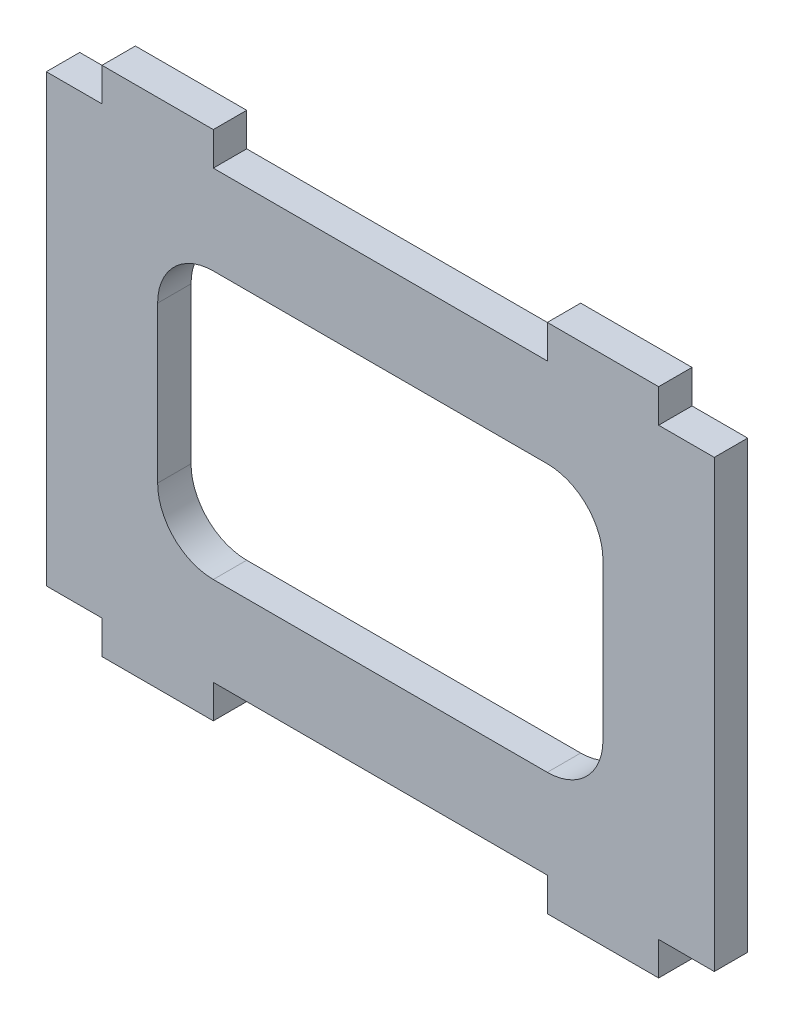
ISO-10303-21;
HEADER;
FILE_DESCRIPTION(('STEP AP214'),'2;1');
FILE_NAME('part.step','',(''),(''),'','','');
FILE_SCHEMA(('AUTOMOTIVE_DESIGN { 1 0 10303 214 1 1 1 1 }'));
ENDSEC;
DATA;
#1=APPLICATION_CONTEXT('core data for automotive mechanical design processes');
#2=APPLICATION_PROTOCOL_DEFINITION('international standard','automotive_design',2000,#1);
#3=PRODUCT_CONTEXT('',#1,'mechanical');
#4=PRODUCT('Part','Part','',(#3));
#5=PRODUCT_RELATED_PRODUCT_CATEGORY('part','',(#4));
#6=PRODUCT_DEFINITION_FORMATION('','',#4);
#7=PRODUCT_DEFINITION_CONTEXT('part definition',#1,'design');
#8=PRODUCT_DEFINITION('design','',#6,#7);
#9=PRODUCT_DEFINITION_SHAPE('','',#8);
#10=(LENGTH_UNIT() NAMED_UNIT(*) SI_UNIT(.MILLI.,.METRE.));
#11=(NAMED_UNIT(*) PLANE_ANGLE_UNIT() SI_UNIT($,.RADIAN.));
#12=(NAMED_UNIT(*) SI_UNIT($,.STERADIAN.) SOLID_ANGLE_UNIT());
#13=UNCERTAINTY_MEASURE_WITH_UNIT(LENGTH_MEASURE(1.E-05),#10,'distance_accuracy_value','');
#14=(GEOMETRIC_REPRESENTATION_CONTEXT(3) GLOBAL_UNCERTAINTY_ASSIGNED_CONTEXT((#13)) GLOBAL_UNIT_ASSIGNED_CONTEXT((#10,
#11,#12)) REPRESENTATION_CONTEXT('',''));
#15=CARTESIAN_POINT('',(0.,0.,0.));
#16=DIRECTION('',(0.,0.,1.));
#17=DIRECTION('',(1.,0.,0.));
#18=AXIS2_PLACEMENT_3D('',#15,#16,#17);
#19=CARTESIAN_POINT('',(5.,-25.,3.));
#20=DIRECTION('',(0.,1.,0.));
#21=DIRECTION('',(0.,0.,1.));
#22=AXIS2_PLACEMENT_3D('',#19,#20,#21);
#23=PLANE('',#22);
#24=DIRECTION('',(1.,0.,0.));
#25=VECTOR('',#24,1.);
#26=CARTESIAN_POINT('',(5.,-25.,0.));
#27=LINE('',#26,#25);
#28=CARTESIAN_POINT('',(5.,-25.,0.));
#29=VERTEX_POINT('',#28);
#30=CARTESIAN_POINT('',(35.,-25.,0.));
#31=VERTEX_POINT('',#30);
#32=EDGE_CURVE('E371',#29,#31,#27,.T.);
#33=ORIENTED_EDGE('',*,*,#32,.T.);
#34=DIRECTION('',(0.,0.,-1.));
#35=VECTOR('',#34,1.);
#36=CARTESIAN_POINT('',(35.,-25.,3.));
#37=LINE('',#36,#35);
#38=CARTESIAN_POINT('',(35.,-25.,3.));
#39=VERTEX_POINT('',#38);
#40=EDGE_CURVE('E316',#39,#31,#37,.T.);
#41=ORIENTED_EDGE('',*,*,#40,.F.);
#42=DIRECTION('',(1.,0.,0.));
#43=VECTOR('',#42,1.);
#44=CARTESIAN_POINT('',(5.,-25.,3.));
#45=LINE('',#44,#43);
#46=CARTESIAN_POINT('',(5.,-25.,3.));
#47=VERTEX_POINT('',#46);
#48=EDGE_CURVE('E372',#47,#39,#45,.T.);
#49=ORIENTED_EDGE('',*,*,#48,.F.);
#50=DIRECTION('',(0.,0.,-1.));
#51=VECTOR('',#50,1.);
#52=CARTESIAN_POINT('',(5.,-25.,3.));
#53=LINE('',#52,#51);
#54=EDGE_CURVE('E395',#47,#29,#53,.T.);
#55=ORIENTED_EDGE('',*,*,#54,.T.);
#56=EDGE_LOOP('',(#33,#41,#49,#55));
#57=FACE_BOUND('',#56,.T.);
#58=ADVANCED_FACE('F35',(#57),#23,.F.);
#59=CARTESIAN_POINT('',(5.,15.,3.));
#60=DIRECTION('',(0.,-1.,0.));
#61=DIRECTION('',(0.,0.,-1.));
#62=AXIS2_PLACEMENT_3D('',#59,#60,#61);
#63=PLANE('',#62);
#64=DIRECTION('',(-1.,0.,0.));
#65=VECTOR('',#64,1.);
#66=CARTESIAN_POINT('',(5.,15.,0.));
#67=LINE('',#66,#65);
#68=CARTESIAN_POINT('',(35.,15.,0.));
#69=VERTEX_POINT('',#68);
#70=CARTESIAN_POINT('',(5.,15.,0.));
#71=VERTEX_POINT('',#70);
#72=EDGE_CURVE('E397',#69,#71,#67,.T.);
#73=ORIENTED_EDGE('',*,*,#72,.T.);
#74=DIRECTION('',(0.,0.,-1.));
#75=VECTOR('',#74,1.);
#76=CARTESIAN_POINT('',(5.,15.,3.));
#77=LINE('',#76,#75);
#78=CARTESIAN_POINT('',(5.,15.,3.));
#79=VERTEX_POINT('',#78);
#80=EDGE_CURVE('E11',#79,#71,#77,.T.);
#81=ORIENTED_EDGE('',*,*,#80,.F.);
#82=DIRECTION('',(-1.,0.,0.));
#83=VECTOR('',#82,1.);
#84=CARTESIAN_POINT('',(5.,15.,3.));
#85=LINE('',#84,#83);
#86=CARTESIAN_POINT('',(35.,15.,3.));
#87=VERTEX_POINT('',#86);
#88=EDGE_CURVE('E374',#87,#79,#85,.T.);
#89=ORIENTED_EDGE('',*,*,#88,.F.);
#90=DIRECTION('',(0.,0.,-1.));
#91=VECTOR('',#90,1.);
#92=CARTESIAN_POINT('',(35.,15.,3.));
#93=LINE('',#92,#91);
#94=EDGE_CURVE('E368',#87,#69,#93,.T.);
#95=ORIENTED_EDGE('',*,*,#94,.T.);
#96=EDGE_LOOP('',(#73,#81,#89,#95));
#97=FACE_BOUND('',#96,.T.);
#98=ADVANCED_FACE('F468',(#97),#63,.F.);
#99=CARTESIAN_POINT('',(5.,18.,3.));
#100=DIRECTION('',(-1.,0.,0.));
#101=DIRECTION('',(0.,-1.,0.));
#102=AXIS2_PLACEMENT_3D('',#99,#100,#101);
#103=PLANE('',#102);
#104=DIRECTION('',(0.,1.,0.));
#105=VECTOR('',#104,1.);
#106=CARTESIAN_POINT('',(5.,18.,0.));
#107=LINE('',#106,#105);
#108=CARTESIAN_POINT('',(5.,18.,0.));
#109=VERTEX_POINT('',#108);
#110=EDGE_CURVE('E399',#71,#109,#107,.T.);
#111=ORIENTED_EDGE('',*,*,#110,.T.);
#112=DIRECTION('',(0.,0.,-1.));
#113=VECTOR('',#112,1.);
#114=CARTESIAN_POINT('',(5.,18.,3.));
#115=LINE('',#114,#113);
#116=CARTESIAN_POINT('',(5.,18.,3.));
#117=VERTEX_POINT('',#116);
#118=EDGE_CURVE('E42',#117,#109,#115,.T.);
#119=ORIENTED_EDGE('',*,*,#118,.F.);
#120=DIRECTION('',(0.,1.,0.));
#121=VECTOR('',#120,1.);
#122=CARTESIAN_POINT('',(5.,18.,3.));
#123=LINE('',#122,#121);
#124=EDGE_CURVE('E377',#79,#117,#123,.T.);
#125=ORIENTED_EDGE('',*,*,#124,.F.);
#126=ORIENTED_EDGE('',*,*,#80,.T.);
#127=EDGE_LOOP('',(#111,#119,#125,#126));
#128=FACE_BOUND('',#127,.T.);
#129=ADVANCED_FACE('F466',(#128),#103,.F.);
#130=CARTESIAN_POINT('',(-5.,18.,3.));
#131=DIRECTION('',(0.,-1.,0.));
#132=DIRECTION('',(0.,0.,-1.));
#133=AXIS2_PLACEMENT_3D('',#130,#131,#132);
#134=PLANE('',#133);
#135=DIRECTION('',(-1.,0.,0.));
#136=VECTOR('',#135,1.);
#137=CARTESIAN_POINT('',(-5.,18.,0.));
#138=LINE('',#137,#136);
#139=CARTESIAN_POINT('',(-5.,18.,0.));
#140=VERTEX_POINT('',#139);
#141=EDGE_CURVE('E401',#109,#140,#138,.T.);
#142=ORIENTED_EDGE('',*,*,#141,.T.);
#143=DIRECTION('',(0.,0.,-1.));
#144=VECTOR('',#143,1.);
#145=CARTESIAN_POINT('',(-5.,18.,3.));
#146=LINE('',#145,#144);
#147=CARTESIAN_POINT('',(-5.,18.,3.));
#148=VERTEX_POINT('',#147);
#149=EDGE_CURVE('E436',#148,#140,#146,.T.);
#150=ORIENTED_EDGE('',*,*,#149,.F.);
#151=DIRECTION('',(-1.,0.,0.));
#152=VECTOR('',#151,1.);
#153=CARTESIAN_POINT('',(-5.,18.,3.));
#154=LINE('',#153,#152);
#155=EDGE_CURVE('E379',#117,#148,#154,.T.);
#156=ORIENTED_EDGE('',*,*,#155,.F.);
#157=ORIENTED_EDGE('',*,*,#118,.T.);
#158=EDGE_LOOP('',(#142,#150,#156,#157));
#159=FACE_BOUND('',#158,.T.);
#160=ADVANCED_FACE('F443',(#159),#134,.F.);
#161=CARTESIAN_POINT('',(-5.,18.,3.));
#162=DIRECTION('',(1.,0.,0.));
#163=DIRECTION('',(0.,0.,-1.));
#164=AXIS2_PLACEMENT_3D('',#161,#162,#163);
#165=PLANE('',#164);
#166=DIRECTION('',(0.,-1.,0.));
#167=VECTOR('',#166,1.);
#168=CARTESIAN_POINT('',(-5.,18.,0.));
#169=LINE('',#168,#167);
#170=CARTESIAN_POINT('',(-5.,15.,0.));
#171=VERTEX_POINT('',#170);
#172=EDGE_CURVE('E403',#140,#171,#169,.T.);
#173=ORIENTED_EDGE('',*,*,#172,.T.);
#174=DIRECTION('',(0.,0.,-1.));
#175=VECTOR('',#174,1.);
#176=CARTESIAN_POINT('',(-5.,15.,3.));
#177=LINE('',#176,#175);
#178=CARTESIAN_POINT('',(-5.,15.,3.));
#179=VERTEX_POINT('',#178);
#180=EDGE_CURVE('E433',#179,#171,#177,.T.);
#181=ORIENTED_EDGE('',*,*,#180,.F.);
#182=DIRECTION('',(0.,-1.,0.));
#183=VECTOR('',#182,1.);
#184=CARTESIAN_POINT('',(-5.,18.,3.));
#185=LINE('',#184,#183);
#186=EDGE_CURVE('E381',#148,#179,#185,.T.);
#187=ORIENTED_EDGE('',*,*,#186,.F.);
#188=ORIENTED_EDGE('',*,*,#149,.T.);
#189=EDGE_LOOP('',(#173,#181,#187,#188));
#190=FACE_BOUND('',#189,.T.);
#191=ADVANCED_FACE('F454',(#190),#165,.F.);
#192=CARTESIAN_POINT('',(-10.,15.,3.));
#193=DIRECTION('',(0.,-1.,0.));
#194=DIRECTION('',(0.,0.,-1.));
#195=AXIS2_PLACEMENT_3D('',#192,#193,#194);
#196=PLANE('',#195);
#197=DIRECTION('',(-1.,0.,0.));
#198=VECTOR('',#197,1.);
#199=CARTESIAN_POINT('',(-10.,15.,0.));
#200=LINE('',#199,#198);
#201=CARTESIAN_POINT('',(-10.,15.,0.));
#202=VERTEX_POINT('',#201);
#203=EDGE_CURVE('E405',#171,#202,#200,.T.);
#204=ORIENTED_EDGE('',*,*,#203,.T.);
#205=DIRECTION('',(0.,0.,-1.));
#206=VECTOR('',#205,1.);
#207=CARTESIAN_POINT('',(-10.,15.,3.));
#208=LINE('',#207,#206);
#209=CARTESIAN_POINT('',(-10.,15.,3.));
#210=VERTEX_POINT('',#209);
#211=EDGE_CURVE('E430',#210,#202,#208,.T.);
#212=ORIENTED_EDGE('',*,*,#211,.F.);
#213=DIRECTION('',(-1.,0.,0.));
#214=VECTOR('',#213,1.);
#215=CARTESIAN_POINT('',(-10.,15.,3.));
#216=LINE('',#215,#214);
#217=EDGE_CURVE('E383',#179,#210,#216,.T.);
#218=ORIENTED_EDGE('',*,*,#217,.F.);
#219=ORIENTED_EDGE('',*,*,#180,.T.);
#220=EDGE_LOOP('',(#204,#212,#218,#219));
#221=FACE_BOUND('',#220,.T.);
#222=ADVANCED_FACE('F458',(#221),#196,.F.);
#223=CARTESIAN_POINT('',(-10.,15.,3.));
#224=DIRECTION('',(1.,0.,0.));
#225=DIRECTION('',(0.,1.,0.));
#226=AXIS2_PLACEMENT_3D('',#223,#224,#225);
#227=PLANE('',#226);
#228=DIRECTION('',(0.,-1.,0.));
#229=VECTOR('',#228,1.);
#230=CARTESIAN_POINT('',(-10.,15.,0.));
#231=LINE('',#230,#229);
#232=CARTESIAN_POINT('',(-9.99999999999999,-25.,0.));
#233=VERTEX_POINT('',#232);
#234=EDGE_CURVE('E407',#202,#233,#231,.T.);
#235=ORIENTED_EDGE('',*,*,#234,.T.);
#236=DIRECTION('',(0.,0.,-1.));
#237=VECTOR('',#236,1.);
#238=CARTESIAN_POINT('',(-9.99999999999999,-25.,3.));
#239=LINE('',#238,#237);
#240=CARTESIAN_POINT('',(-9.99999999999999,-25.,3.));
#241=VERTEX_POINT('',#240);
#242=EDGE_CURVE('E427',#241,#233,#239,.T.);
#243=ORIENTED_EDGE('',*,*,#242,.F.);
#244=DIRECTION('',(0.,-1.,0.));
#245=VECTOR('',#244,1.);
#246=CARTESIAN_POINT('',(-10.,15.,3.));
#247=LINE('',#246,#245);
#248=EDGE_CURVE('E385',#210,#241,#247,.T.);
#249=ORIENTED_EDGE('',*,*,#248,.F.);
#250=ORIENTED_EDGE('',*,*,#211,.T.);
#251=EDGE_LOOP('',(#235,#243,#249,#250));
#252=FACE_BOUND('',#251,.T.);
#253=ADVANCED_FACE('F521',(#252),#227,.F.);
#254=CARTESIAN_POINT('',(-9.99999999999999,-25.,3.));
#255=DIRECTION('',(0.,1.,0.));
#256=DIRECTION('',(0.,0.,1.));
#257=AXIS2_PLACEMENT_3D('',#254,#255,#256);
#258=PLANE('',#257);
#259=DIRECTION('',(1.,0.,0.));
#260=VECTOR('',#259,1.);
#261=CARTESIAN_POINT('',(-9.99999999999999,-25.,0.));
#262=LINE('',#261,#260);
#263=CARTESIAN_POINT('',(-5.,-25.,0.));
#264=VERTEX_POINT('',#263);
#265=EDGE_CURVE('E409',#233,#264,#262,.T.);
#266=ORIENTED_EDGE('',*,*,#265,.T.);
#267=DIRECTION('',(0.,0.,-1.));
#268=VECTOR('',#267,1.);
#269=CARTESIAN_POINT('',(-5.,-25.,3.));
#270=LINE('',#269,#268);
#271=CARTESIAN_POINT('',(-5.,-25.,3.));
#272=VERTEX_POINT('',#271);
#273=EDGE_CURVE('E424',#272,#264,#270,.T.);
#274=ORIENTED_EDGE('',*,*,#273,.F.);
#275=DIRECTION('',(1.,0.,0.));
#276=VECTOR('',#275,1.);
#277=CARTESIAN_POINT('',(-9.99999999999999,-25.,3.));
#278=LINE('',#277,#276);
#279=EDGE_CURVE('E387',#241,#272,#278,.T.);
#280=ORIENTED_EDGE('',*,*,#279,.F.);
#281=ORIENTED_EDGE('',*,*,#242,.T.);
#282=EDGE_LOOP('',(#266,#274,#280,#281));
#283=FACE_BOUND('',#282,.T.);
#284=ADVANCED_FACE('F519',(#283),#258,.F.);
#285=CARTESIAN_POINT('',(-5.,-25.,3.));
#286=DIRECTION('',(1.,0.,0.));
#287=DIRECTION('',(0.,1.,0.));
#288=AXIS2_PLACEMENT_3D('',#285,#286,#287);
#289=PLANE('',#288);
#290=DIRECTION('',(0.,-1.,0.));
#291=VECTOR('',#290,1.);
#292=CARTESIAN_POINT('',(-5.,-25.,0.));
#293=LINE('',#292,#291);
#294=CARTESIAN_POINT('',(-5.,-28.,0.));
#295=VERTEX_POINT('',#294);
#296=EDGE_CURVE('E411',#264,#295,#293,.T.);
#297=ORIENTED_EDGE('',*,*,#296,.T.);
#298=DIRECTION('',(0.,0.,-1.));
#299=VECTOR('',#298,1.);
#300=CARTESIAN_POINT('',(-5.,-28.,3.));
#301=LINE('',#300,#299);
#302=CARTESIAN_POINT('',(-5.,-28.,3.));
#303=VERTEX_POINT('',#302);
#304=EDGE_CURVE('E421',#303,#295,#301,.T.);
#305=ORIENTED_EDGE('',*,*,#304,.F.);
#306=DIRECTION('',(0.,-1.,0.));
#307=VECTOR('',#306,1.);
#308=CARTESIAN_POINT('',(-5.,-25.,3.));
#309=LINE('',#308,#307);
#310=EDGE_CURVE('E389',#272,#303,#309,.T.);
#311=ORIENTED_EDGE('',*,*,#310,.F.);
#312=ORIENTED_EDGE('',*,*,#273,.T.);
#313=EDGE_LOOP('',(#297,#305,#311,#312));
#314=FACE_BOUND('',#313,.T.);
#315=ADVANCED_FACE('F515',(#314),#289,.F.);
#316=CARTESIAN_POINT('',(-5.,-28.,3.));
#317=DIRECTION('',(0.,1.,0.));
#318=DIRECTION('',(0.,0.,1.));
#319=AXIS2_PLACEMENT_3D('',#316,#317,#318);
#320=PLANE('',#319);
#321=DIRECTION('',(1.,0.,0.));
#322=VECTOR('',#321,1.);
#323=CARTESIAN_POINT('',(-5.,-28.,0.));
#324=LINE('',#323,#322);
#325=CARTESIAN_POINT('',(5.,-28.,0.));
#326=VERTEX_POINT('',#325);
#327=EDGE_CURVE('E413',#295,#326,#324,.T.);
#328=ORIENTED_EDGE('',*,*,#327,.T.);
#329=DIRECTION('',(0.,0.,-1.));
#330=VECTOR('',#329,1.);
#331=CARTESIAN_POINT('',(5.,-28.,3.));
#332=LINE('',#331,#330);
#333=CARTESIAN_POINT('',(5.,-28.,3.));
#334=VERTEX_POINT('',#333);
#335=EDGE_CURVE('E418',#334,#326,#332,.T.);
#336=ORIENTED_EDGE('',*,*,#335,.F.);
#337=DIRECTION('',(1.,0.,0.));
#338=VECTOR('',#337,1.);
#339=CARTESIAN_POINT('',(-5.,-28.,3.));
#340=LINE('',#339,#338);
#341=EDGE_CURVE('E391',#303,#334,#340,.T.);
#342=ORIENTED_EDGE('',*,*,#341,.F.);
#343=ORIENTED_EDGE('',*,*,#304,.T.);
#344=EDGE_LOOP('',(#328,#336,#342,#343));
#345=FACE_BOUND('',#344,.T.);
#346=ADVANCED_FACE('F510',(#345),#320,.F.);
#347=CARTESIAN_POINT('',(5.,-25.,3.));
#348=DIRECTION('',(-1.,0.,0.));
#349=DIRECTION('',(0.,0.,1.));
#350=AXIS2_PLACEMENT_3D('',#347,#348,#349);
#351=PLANE('',#350);
#352=DIRECTION('',(0.,1.,0.));
#353=VECTOR('',#352,1.);
#354=CARTESIAN_POINT('',(5.,-25.,0.));
#355=LINE('',#354,#353);
#356=EDGE_CURVE('E375',#326,#29,#355,.T.);
#357=ORIENTED_EDGE('',*,*,#356,.T.);
#358=ORIENTED_EDGE('',*,*,#54,.F.);
#359=DIRECTION('',(0.,1.,0.));
#360=VECTOR('',#359,1.);
#361=CARTESIAN_POINT('',(5.,-25.,3.));
#362=LINE('',#361,#360);
#363=EDGE_CURVE('E393',#334,#47,#362,.T.);
#364=ORIENTED_EDGE('',*,*,#363,.F.);
#365=ORIENTED_EDGE('',*,*,#335,.T.);
#366=EDGE_LOOP('',(#357,#358,#364,#365));
#367=FACE_BOUND('',#366,.T.);
#368=ADVANCED_FACE('F504',(#367),#351,.F.);
#369=CARTESIAN_POINT('',(0.,0.,3.));
#370=DIRECTION('',(0.,0.,-1.));
#371=DIRECTION('',(-1.,0.,0.));
#372=AXIS2_PLACEMENT_3D('',#369,#370,#371);
#373=PLANE('',#372);
#374=DIRECTION('',(-1.,0.,0.));
#375=VECTOR('',#374,1.);
#376=CARTESIAN_POINT('',(5.00000000000004,7.,3.));
#377=LINE('',#376,#375);
#378=CARTESIAN_POINT('',(35.,7.,3.));
#379=VERTEX_POINT('',#378);
#380=CARTESIAN_POINT('',(5.00000000000004,7.,3.));
#381=VERTEX_POINT('',#380);
#382=EDGE_CURVE('E258',#379,#381,#377,.T.);
#383=ORIENTED_EDGE('',*,*,#382,.F.);
#384=CARTESIAN_POINT('',(35.,2.,3.));
#385=DIRECTION('',(0.,0.,1.));
#386=DIRECTION('',(-1.,0.,0.));
#387=AXIS2_PLACEMENT_3D('',#384,#385,#386);
#388=CIRCLE('',#387,5.);
#389=CARTESIAN_POINT('',(40.,1.99999999999996,3.));
#390=VERTEX_POINT('',#389);
#391=EDGE_CURVE('E49',#390,#379,#388,.T.);
#392=ORIENTED_EDGE('',*,*,#391,.F.);
#393=DIRECTION('',(0.,1.,0.));
#394=VECTOR('',#393,1.);
#395=CARTESIAN_POINT('',(40.,1.99999999999996,3.));
#396=LINE('',#395,#394);
#397=CARTESIAN_POINT('',(40.,-12.,3.));
#398=VERTEX_POINT('',#397);
#399=EDGE_CURVE('E238',#398,#390,#396,.T.);
#400=ORIENTED_EDGE('',*,*,#399,.F.);
#401=CARTESIAN_POINT('',(35.,-12.,3.));
#402=DIRECTION('',(0.,0.,1.));
#403=DIRECTION('',(1.,0.,0.));
#404=AXIS2_PLACEMENT_3D('',#401,#402,#403);
#405=CIRCLE('',#404,5.);
#406=CARTESIAN_POINT('',(35.,-17.,3.));
#407=VERTEX_POINT('',#406);
#408=EDGE_CURVE('E241',#407,#398,#405,.T.);
#409=ORIENTED_EDGE('',*,*,#408,.F.);
#410=DIRECTION('',(1.,0.,0.));
#411=VECTOR('',#410,1.);
#412=CARTESIAN_POINT('',(5.00000000000004,-17.,3.));
#413=LINE('',#412,#411);
#414=CARTESIAN_POINT('',(5.00000000000004,-17.,3.));
#415=VERTEX_POINT('',#414);
#416=EDGE_CURVE('E269',#415,#407,#413,.T.);
#417=ORIENTED_EDGE('',*,*,#416,.F.);
#418=CARTESIAN_POINT('',(5.,-12.,3.));
#419=DIRECTION('',(0.,0.,1.));
#420=DIRECTION('',(1.,0.,0.));
#421=AXIS2_PLACEMENT_3D('',#418,#419,#420);
#422=CIRCLE('',#421,5.);
#423=CARTESIAN_POINT('',(0.,-12.,3.));
#424=VERTEX_POINT('',#423);
#425=EDGE_CURVE('E266',#424,#415,#422,.T.);
#426=ORIENTED_EDGE('',*,*,#425,.F.);
#427=DIRECTION('',(0.,-1.,0.));
#428=VECTOR('',#427,1.);
#429=CARTESIAN_POINT('',(0.,1.99999999999996,3.));
#430=LINE('',#429,#428);
#431=CARTESIAN_POINT('',(0.,1.99999999999996,3.));
#432=VERTEX_POINT('',#431);
#433=EDGE_CURVE('E263',#432,#424,#430,.T.);
#434=ORIENTED_EDGE('',*,*,#433,.F.);
#435=CARTESIAN_POINT('',(5.,2.,3.));
#436=DIRECTION('',(0.,0.,1.));
#437=DIRECTION('',(1.,0.,0.));
#438=AXIS2_PLACEMENT_3D('',#435,#436,#437);
#439=CIRCLE('',#438,5.);
#440=EDGE_CURVE('E260',#381,#432,#439,.T.);
#441=ORIENTED_EDGE('',*,*,#440,.F.);
#442=EDGE_LOOP('',(#383,#392,#400,#409,#417,#426,#434,#441));
#443=FACE_BOUND('',#442,.T.);
#444=ORIENTED_EDGE('',*,*,#48,.T.);
#445=DIRECTION('',(0.,1.,0.));
#446=VECTOR('',#445,1.);
#447=CARTESIAN_POINT('',(35.,-25.,3.));
#448=LINE('',#447,#446);
#449=CARTESIAN_POINT('',(35.,-28.,3.));
#450=VERTEX_POINT('',#449);
#451=EDGE_CURVE('E313',#450,#39,#448,.T.);
#452=ORIENTED_EDGE('',*,*,#451,.F.);
#453=DIRECTION('',(-1.,0.,0.));
#454=VECTOR('',#453,1.);
#455=CARTESIAN_POINT('',(45.,-28.,3.));
#456=LINE('',#455,#454);
#457=CARTESIAN_POINT('',(45.,-28.,3.));
#458=VERTEX_POINT('',#457);
#459=EDGE_CURVE('E310',#458,#450,#456,.T.);
#460=ORIENTED_EDGE('',*,*,#459,.F.);
#461=DIRECTION('',(0.,-1.,0.));
#462=VECTOR('',#461,1.);
#463=CARTESIAN_POINT('',(45.,-25.,3.));
#464=LINE('',#463,#462);
#465=CARTESIAN_POINT('',(45.,-25.,3.));
#466=VERTEX_POINT('',#465);
#467=EDGE_CURVE('E307',#466,#458,#464,.T.);
#468=ORIENTED_EDGE('',*,*,#467,.F.);
#469=DIRECTION('',(-1.,0.,0.));
#470=VECTOR('',#469,1.);
#471=CARTESIAN_POINT('',(50.,-25.,3.));
#472=LINE('',#471,#470);
#473=CARTESIAN_POINT('',(50.,-25.,3.));
#474=VERTEX_POINT('',#473);
#475=EDGE_CURVE('E304',#474,#466,#472,.T.);
#476=ORIENTED_EDGE('',*,*,#475,.F.);
#477=DIRECTION('',(0.,-1.,0.));
#478=VECTOR('',#477,1.);
#479=CARTESIAN_POINT('',(50.,15.,3.));
#480=LINE('',#479,#478);
#481=CARTESIAN_POINT('',(50.,15.,3.));
#482=VERTEX_POINT('',#481);
#483=EDGE_CURVE('E301',#482,#474,#480,.T.);
#484=ORIENTED_EDGE('',*,*,#483,.F.);
#485=DIRECTION('',(1.,0.,0.));
#486=VECTOR('',#485,1.);
#487=CARTESIAN_POINT('',(50.,15.,3.));
#488=LINE('',#487,#486);
#489=CARTESIAN_POINT('',(45.,15.,3.));
#490=VERTEX_POINT('',#489);
#491=EDGE_CURVE('E298',#490,#482,#488,.T.);
#492=ORIENTED_EDGE('',*,*,#491,.F.);
#493=DIRECTION('',(0.,-1.,0.));
#494=VECTOR('',#493,1.);
#495=CARTESIAN_POINT('',(45.,18.,3.));
#496=LINE('',#495,#494);
#497=CARTESIAN_POINT('',(45.,18.,3.));
#498=VERTEX_POINT('',#497);
#499=EDGE_CURVE('E295',#498,#490,#496,.T.);
#500=ORIENTED_EDGE('',*,*,#499,.F.);
#501=DIRECTION('',(1.,0.,0.));
#502=VECTOR('',#501,1.);
#503=CARTESIAN_POINT('',(45.,18.,3.));
#504=LINE('',#503,#502);
#505=CARTESIAN_POINT('',(35.,18.,3.));
#506=VERTEX_POINT('',#505);
#507=EDGE_CURVE('E291',#506,#498,#504,.T.);
#508=ORIENTED_EDGE('',*,*,#507,.F.);
#509=DIRECTION('',(0.,1.,0.));
#510=VECTOR('',#509,1.);
#511=CARTESIAN_POINT('',(35.,18.,3.));
#512=LINE('',#511,#510);
#513=EDGE_CURVE('E288',#87,#506,#512,.T.);
#514=ORIENTED_EDGE('',*,*,#513,.F.);
#515=ORIENTED_EDGE('',*,*,#88,.T.);
#516=ORIENTED_EDGE('',*,*,#124,.T.);
#517=ORIENTED_EDGE('',*,*,#155,.T.);
#518=ORIENTED_EDGE('',*,*,#186,.T.);
#519=ORIENTED_EDGE('',*,*,#217,.T.);
#520=ORIENTED_EDGE('',*,*,#248,.T.);
#521=ORIENTED_EDGE('',*,*,#279,.T.);
#522=ORIENTED_EDGE('',*,*,#310,.T.);
#523=ORIENTED_EDGE('',*,*,#341,.T.);
#524=ORIENTED_EDGE('',*,*,#363,.T.);
#525=EDGE_LOOP('',(#444,#452,#460,#468,#476,#484,#492,#500,#508,#514,#515,#516,#517,#518,#519,
#520,#521,#522,#523,#524));
#526=FACE_BOUND('',#525,.T.);
#527=ADVANCED_FACE('F462',(#443,#526),#373,.F.);
#528=CARTESIAN_POINT('',(0.,0.,0.));
#529=DIRECTION('',(0.,0.,-1.));
#530=DIRECTION('',(-1.,0.,0.));
#531=AXIS2_PLACEMENT_3D('',#528,#529,#530);
#532=PLANE('',#531);
#533=CARTESIAN_POINT('',(35.,2.,0.));
#534=DIRECTION('',(0.,0.,1.));
#535=DIRECTION('',(-1.,0.,0.));
#536=AXIS2_PLACEMENT_3D('',#533,#534,#535);
#537=CIRCLE('',#536,5.);
#538=CARTESIAN_POINT('',(40.,1.99999999999996,0.));
#539=VERTEX_POINT('',#538);
#540=CARTESIAN_POINT('',(35.,7.,0.));
#541=VERTEX_POINT('',#540);
#542=EDGE_CURVE('E221',#539,#541,#537,.T.);
#543=ORIENTED_EDGE('',*,*,#542,.T.);
#544=DIRECTION('',(-1.,0.,0.));
#545=VECTOR('',#544,1.);
#546=CARTESIAN_POINT('',(5.00000000000004,7.,0.));
#547=LINE('',#546,#545);
#548=CARTESIAN_POINT('',(5.00000000000004,7.,0.));
#549=VERTEX_POINT('',#548);
#550=EDGE_CURVE('E230',#541,#549,#547,.T.);
#551=ORIENTED_EDGE('',*,*,#550,.T.);
#552=CARTESIAN_POINT('',(5.,2.,0.));
#553=DIRECTION('',(0.,0.,1.));
#554=DIRECTION('',(1.,0.,0.));
#555=AXIS2_PLACEMENT_3D('',#552,#553,#554);
#556=CIRCLE('',#555,5.);
#557=CARTESIAN_POINT('',(0.,1.99999999999996,0.));
#558=VERTEX_POINT('',#557);
#559=EDGE_CURVE('E57',#549,#558,#556,.T.);
#560=ORIENTED_EDGE('',*,*,#559,.T.);
#561=DIRECTION('',(0.,-1.,0.));
#562=VECTOR('',#561,1.);
#563=CARTESIAN_POINT('',(0.,1.99999999999996,0.));
#564=LINE('',#563,#562);
#565=CARTESIAN_POINT('',(0.,-12.,0.));
#566=VERTEX_POINT('',#565);
#567=EDGE_CURVE('E245',#558,#566,#564,.T.);
#568=ORIENTED_EDGE('',*,*,#567,.T.);
#569=CARTESIAN_POINT('',(5.,-12.,0.));
#570=DIRECTION('',(0.,0.,1.));
#571=DIRECTION('',(1.,0.,0.));
#572=AXIS2_PLACEMENT_3D('',#569,#570,#571);
#573=CIRCLE('',#572,5.);
#574=CARTESIAN_POINT('',(5.00000000000004,-17.,0.));
#575=VERTEX_POINT('',#574);
#576=EDGE_CURVE('E248',#566,#575,#573,.T.);
#577=ORIENTED_EDGE('',*,*,#576,.T.);
#578=DIRECTION('',(1.,0.,0.));
#579=VECTOR('',#578,1.);
#580=CARTESIAN_POINT('',(5.00000000000004,-17.,0.));
#581=LINE('',#580,#579);
#582=CARTESIAN_POINT('',(35.,-17.,0.));
#583=VERTEX_POINT('',#582);
#584=EDGE_CURVE('E251',#575,#583,#581,.T.);
#585=ORIENTED_EDGE('',*,*,#584,.T.);
#586=CARTESIAN_POINT('',(35.,-12.,0.));
#587=DIRECTION('',(0.,0.,1.));
#588=DIRECTION('',(1.,0.,0.));
#589=AXIS2_PLACEMENT_3D('',#586,#587,#588);
#590=CIRCLE('',#589,5.);
#591=CARTESIAN_POINT('',(40.,-12.,0.));
#592=VERTEX_POINT('',#591);
#593=EDGE_CURVE('E254',#583,#592,#590,.T.);
#594=ORIENTED_EDGE('',*,*,#593,.T.);
#595=DIRECTION('',(0.,1.,0.));
#596=VECTOR('',#595,1.);
#597=CARTESIAN_POINT('',(40.,1.99999999999996,0.));
#598=LINE('',#597,#596);
#599=EDGE_CURVE('E227',#592,#539,#598,.T.);
#600=ORIENTED_EDGE('',*,*,#599,.T.);
#601=EDGE_LOOP('',(#543,#551,#560,#568,#577,#585,#594,#600));
#602=FACE_BOUND('',#601,.T.);
#603=ORIENTED_EDGE('',*,*,#32,.F.);
#604=ORIENTED_EDGE('',*,*,#356,.F.);
#605=ORIENTED_EDGE('',*,*,#327,.F.);
#606=ORIENTED_EDGE('',*,*,#296,.F.);
#607=ORIENTED_EDGE('',*,*,#265,.F.);
#608=ORIENTED_EDGE('',*,*,#234,.F.);
#609=ORIENTED_EDGE('',*,*,#203,.F.);
#610=ORIENTED_EDGE('',*,*,#172,.F.);
#611=ORIENTED_EDGE('',*,*,#141,.F.);
#612=ORIENTED_EDGE('',*,*,#110,.F.);
#613=ORIENTED_EDGE('',*,*,#72,.F.);
#614=DIRECTION('',(0.,1.,0.));
#615=VECTOR('',#614,1.);
#616=CARTESIAN_POINT('',(35.,18.,0.));
#617=LINE('',#616,#615);
#618=CARTESIAN_POINT('',(35.,18.,0.));
#619=VERTEX_POINT('',#618);
#620=EDGE_CURVE('E276',#69,#619,#617,.T.);
#621=ORIENTED_EDGE('',*,*,#620,.T.);
#622=DIRECTION('',(1.,0.,0.));
#623=VECTOR('',#622,1.);
#624=CARTESIAN_POINT('',(45.,18.,0.));
#625=LINE('',#624,#623);
#626=CARTESIAN_POINT('',(45.,18.,0.));
#627=VERTEX_POINT('',#626);
#628=EDGE_CURVE('E319',#619,#627,#625,.T.);
#629=ORIENTED_EDGE('',*,*,#628,.T.);
#630=DIRECTION('',(0.,-1.,0.));
#631=VECTOR('',#630,1.);
#632=CARTESIAN_POINT('',(45.,18.,0.));
#633=LINE('',#632,#631);
#634=CARTESIAN_POINT('',(45.,15.,0.));
#635=VERTEX_POINT('',#634);
#636=EDGE_CURVE('E322',#627,#635,#633,.T.);
#637=ORIENTED_EDGE('',*,*,#636,.T.);
#638=DIRECTION('',(1.,0.,0.));
#639=VECTOR('',#638,1.);
#640=CARTESIAN_POINT('',(50.,15.,0.));
#641=LINE('',#640,#639);
#642=CARTESIAN_POINT('',(50.,15.,0.));
#643=VERTEX_POINT('',#642);
#644=EDGE_CURVE('E325',#635,#643,#641,.T.);
#645=ORIENTED_EDGE('',*,*,#644,.T.);
#646=DIRECTION('',(0.,-1.,0.));
#647=VECTOR('',#646,1.);
#648=CARTESIAN_POINT('',(50.,15.,0.));
#649=LINE('',#648,#647);
#650=CARTESIAN_POINT('',(50.,-25.,0.));
#651=VERTEX_POINT('',#650);
#652=EDGE_CURVE('E328',#643,#651,#649,.T.);
#653=ORIENTED_EDGE('',*,*,#652,.T.);
#654=DIRECTION('',(-1.,0.,0.));
#655=VECTOR('',#654,1.);
#656=CARTESIAN_POINT('',(50.,-25.,0.));
#657=LINE('',#656,#655);
#658=CARTESIAN_POINT('',(45.,-25.,0.));
#659=VERTEX_POINT('',#658);
#660=EDGE_CURVE('E331',#651,#659,#657,.T.);
#661=ORIENTED_EDGE('',*,*,#660,.T.);
#662=DIRECTION('',(0.,-1.,0.));
#663=VECTOR('',#662,1.);
#664=CARTESIAN_POINT('',(45.,-25.,0.));
#665=LINE('',#664,#663);
#666=CARTESIAN_POINT('',(45.,-28.,0.));
#667=VERTEX_POINT('',#666);
#668=EDGE_CURVE('E334',#659,#667,#665,.T.);
#669=ORIENTED_EDGE('',*,*,#668,.T.);
#670=DIRECTION('',(-1.,0.,0.));
#671=VECTOR('',#670,1.);
#672=CARTESIAN_POINT('',(45.,-28.,0.));
#673=LINE('',#672,#671);
#674=CARTESIAN_POINT('',(35.,-28.,0.));
#675=VERTEX_POINT('',#674);
#676=EDGE_CURVE('E337',#667,#675,#673,.T.);
#677=ORIENTED_EDGE('',*,*,#676,.T.);
#678=DIRECTION('',(0.,1.,0.));
#679=VECTOR('',#678,1.);
#680=CARTESIAN_POINT('',(35.,-25.,0.));
#681=LINE('',#680,#679);
#682=EDGE_CURVE('E292',#675,#31,#681,.T.);
#683=ORIENTED_EDGE('',*,*,#682,.T.);
#684=EDGE_LOOP('',(#603,#604,#605,#606,#607,#608,#609,#610,#611,#612,#613,#621,#629,#637,#645,
#653,#661,#669,#677,#683));
#685=FACE_BOUND('',#684,.T.);
#686=ADVANCED_FACE('F234',(#602,#685),#532,.T.);
#687=CARTESIAN_POINT('',(35.,18.,3.));
#688=DIRECTION('',(1.,0.,0.));
#689=DIRECTION('',(0.,-1.,0.));
#690=AXIS2_PLACEMENT_3D('',#687,#688,#689);
#691=PLANE('',#690);
#692=ORIENTED_EDGE('',*,*,#620,.F.);
#693=ORIENTED_EDGE('',*,*,#94,.F.);
#694=ORIENTED_EDGE('',*,*,#513,.T.);
#695=DIRECTION('',(0.,0.,-1.));
#696=VECTOR('',#695,1.);
#697=CARTESIAN_POINT('',(35.,18.,3.));
#698=LINE('',#697,#696);
#699=EDGE_CURVE('E365',#506,#619,#698,.T.);
#700=ORIENTED_EDGE('',*,*,#699,.T.);
#701=EDGE_LOOP('',(#692,#693,#694,#700));
#702=FACE_BOUND('',#701,.T.);
#703=ADVANCED_FACE('F472',(#702),#691,.F.);
#704=CARTESIAN_POINT('',(45.,18.,3.));
#705=DIRECTION('',(0.,-1.,0.));
#706=DIRECTION('',(0.,0.,-1.));
#707=AXIS2_PLACEMENT_3D('',#704,#705,#706);
#708=PLANE('',#707);
#709=ORIENTED_EDGE('',*,*,#628,.F.);
#710=ORIENTED_EDGE('',*,*,#699,.F.);
#711=ORIENTED_EDGE('',*,*,#507,.T.);
#712=DIRECTION('',(0.,0.,-1.));
#713=VECTOR('',#712,1.);
#714=CARTESIAN_POINT('',(45.,18.,3.));
#715=LINE('',#714,#713);
#716=EDGE_CURVE('E362',#498,#627,#715,.T.);
#717=ORIENTED_EDGE('',*,*,#716,.T.);
#718=EDGE_LOOP('',(#709,#710,#711,#717));
#719=FACE_BOUND('',#718,.T.);
#720=ADVANCED_FACE('F475',(#719),#708,.F.);
#721=CARTESIAN_POINT('',(45.,18.,3.));
#722=DIRECTION('',(-1.,0.,0.));
#723=DIRECTION('',(0.,0.,-1.));
#724=AXIS2_PLACEMENT_3D('',#721,#722,#723);
#725=PLANE('',#724);
#726=ORIENTED_EDGE('',*,*,#636,.F.);
#727=ORIENTED_EDGE('',*,*,#716,.F.);
#728=ORIENTED_EDGE('',*,*,#499,.T.);
#729=DIRECTION('',(0.,0.,-1.));
#730=VECTOR('',#729,1.);
#731=CARTESIAN_POINT('',(45.,15.,3.));
#732=LINE('',#731,#730);
#733=EDGE_CURVE('E359',#490,#635,#732,.T.);
#734=ORIENTED_EDGE('',*,*,#733,.T.);
#735=EDGE_LOOP('',(#726,#727,#728,#734));
#736=FACE_BOUND('',#735,.T.);
#737=ADVANCED_FACE('F478',(#736),#725,.F.);
#738=CARTESIAN_POINT('',(50.,15.,3.));
#739=DIRECTION('',(0.,-1.,0.));
#740=DIRECTION('',(0.,0.,-1.));
#741=AXIS2_PLACEMENT_3D('',#738,#739,#740);
#742=PLANE('',#741);
#743=ORIENTED_EDGE('',*,*,#644,.F.);
#744=ORIENTED_EDGE('',*,*,#733,.F.);
#745=ORIENTED_EDGE('',*,*,#491,.T.);
#746=DIRECTION('',(0.,0.,-1.));
#747=VECTOR('',#746,1.);
#748=CARTESIAN_POINT('',(50.,15.,3.));
#749=LINE('',#748,#747);
#750=EDGE_CURVE('E356',#482,#643,#749,.T.);
#751=ORIENTED_EDGE('',*,*,#750,.T.);
#752=EDGE_LOOP('',(#743,#744,#745,#751));
#753=FACE_BOUND('',#752,.T.);
#754=ADVANCED_FACE('F481',(#753),#742,.F.);
#755=CARTESIAN_POINT('',(50.,15.,3.));
#756=DIRECTION('',(-1.,0.,0.));
#757=DIRECTION('',(0.,1.,0.));
#758=AXIS2_PLACEMENT_3D('',#755,#756,#757);
#759=PLANE('',#758);
#760=ORIENTED_EDGE('',*,*,#652,.F.);
#761=ORIENTED_EDGE('',*,*,#750,.F.);
#762=ORIENTED_EDGE('',*,*,#483,.T.);
#763=DIRECTION('',(0.,0.,-1.));
#764=VECTOR('',#763,1.);
#765=CARTESIAN_POINT('',(50.,-25.,3.));
#766=LINE('',#765,#764);
#767=EDGE_CURVE('E353',#474,#651,#766,.T.);
#768=ORIENTED_EDGE('',*,*,#767,.T.);
#769=EDGE_LOOP('',(#760,#761,#762,#768));
#770=FACE_BOUND('',#769,.T.);
#771=ADVANCED_FACE('F484',(#770),#759,.F.);
#772=CARTESIAN_POINT('',(50.,-25.,3.));
#773=DIRECTION('',(0.,1.,0.));
#774=DIRECTION('',(0.,0.,1.));
#775=AXIS2_PLACEMENT_3D('',#772,#773,#774);
#776=PLANE('',#775);
#777=ORIENTED_EDGE('',*,*,#660,.F.);
#778=ORIENTED_EDGE('',*,*,#767,.F.);
#779=ORIENTED_EDGE('',*,*,#475,.T.);
#780=DIRECTION('',(0.,0.,-1.));
#781=VECTOR('',#780,1.);
#782=CARTESIAN_POINT('',(45.,-25.,3.));
#783=LINE('',#782,#781);
#784=EDGE_CURVE('E350',#466,#659,#783,.T.);
#785=ORIENTED_EDGE('',*,*,#784,.T.);
#786=EDGE_LOOP('',(#777,#778,#779,#785));
#787=FACE_BOUND('',#786,.T.);
#788=ADVANCED_FACE('F487',(#787),#776,.F.);
#789=CARTESIAN_POINT('',(45.,-25.,3.));
#790=DIRECTION('',(-1.,0.,0.));
#791=DIRECTION('',(0.,1.,0.));
#792=AXIS2_PLACEMENT_3D('',#789,#790,#791);
#793=PLANE('',#792);
#794=ORIENTED_EDGE('',*,*,#668,.F.);
#795=ORIENTED_EDGE('',*,*,#784,.F.);
#796=ORIENTED_EDGE('',*,*,#467,.T.);
#797=DIRECTION('',(0.,0.,-1.));
#798=VECTOR('',#797,1.);
#799=CARTESIAN_POINT('',(45.,-28.,3.));
#800=LINE('',#799,#798);
#801=EDGE_CURVE('E347',#458,#667,#800,.T.);
#802=ORIENTED_EDGE('',*,*,#801,.T.);
#803=EDGE_LOOP('',(#794,#795,#796,#802));
#804=FACE_BOUND('',#803,.T.);
#805=ADVANCED_FACE('F490',(#804),#793,.F.);
#806=CARTESIAN_POINT('',(45.,-28.,3.));
#807=DIRECTION('',(0.,1.,0.));
#808=DIRECTION('',(0.,0.,1.));
#809=AXIS2_PLACEMENT_3D('',#806,#807,#808);
#810=PLANE('',#809);
#811=ORIENTED_EDGE('',*,*,#676,.F.);
#812=ORIENTED_EDGE('',*,*,#801,.F.);
#813=ORIENTED_EDGE('',*,*,#459,.T.);
#814=DIRECTION('',(0.,0.,-1.));
#815=VECTOR('',#814,1.);
#816=CARTESIAN_POINT('',(35.,-28.,3.));
#817=LINE('',#816,#815);
#818=EDGE_CURVE('E344',#450,#675,#817,.T.);
#819=ORIENTED_EDGE('',*,*,#818,.T.);
#820=EDGE_LOOP('',(#811,#812,#813,#819));
#821=FACE_BOUND('',#820,.T.);
#822=ADVANCED_FACE('F493',(#821),#810,.F.);
#823=CARTESIAN_POINT('',(35.,-25.,3.));
#824=DIRECTION('',(1.,0.,0.));
#825=DIRECTION('',(0.,0.,1.));
#826=AXIS2_PLACEMENT_3D('',#823,#824,#825);
#827=PLANE('',#826);
#828=ORIENTED_EDGE('',*,*,#682,.F.);
#829=ORIENTED_EDGE('',*,*,#818,.F.);
#830=ORIENTED_EDGE('',*,*,#451,.T.);
#831=ORIENTED_EDGE('',*,*,#40,.T.);
#832=EDGE_LOOP('',(#828,#829,#830,#831));
#833=FACE_BOUND('',#832,.T.);
#834=ADVANCED_FACE('F498',(#833),#827,.F.);
#835=CARTESIAN_POINT('',(35.,2.,0.));
#836=DIRECTION('',(0.,0.,1.));
#837=DIRECTION('',(1.,0.,0.));
#838=AXIS2_PLACEMENT_3D('',#835,#836,#837);
#839=CYLINDRICAL_SURFACE('',#838,5.);
#840=ORIENTED_EDGE('',*,*,#391,.T.);
#841=DIRECTION('',(0.,0.,1.));
#842=VECTOR('',#841,1.);
#843=CARTESIAN_POINT('',(35.,7.,0.));
#844=LINE('',#843,#842);
#845=EDGE_CURVE('E217',#541,#379,#844,.T.);
#846=ORIENTED_EDGE('',*,*,#845,.F.);
#847=ORIENTED_EDGE('',*,*,#542,.F.);
#848=DIRECTION('',(0.,0.,1.));
#849=VECTOR('',#848,1.);
#850=CARTESIAN_POINT('',(40.,1.99999999999996,0.));
#851=LINE('',#850,#849);
#852=EDGE_CURVE('E274',#539,#390,#851,.T.);
#853=ORIENTED_EDGE('',*,*,#852,.T.);
#854=EDGE_LOOP('',(#840,#846,#847,#853));
#855=FACE_BOUND('',#854,.T.);
#856=ADVANCED_FACE('F219',(#855),#839,.F.);
#857=CARTESIAN_POINT('',(40.,1.99999999999996,0.));
#858=DIRECTION('',(1.,0.,0.));
#859=DIRECTION('',(0.,0.,-1.));
#860=AXIS2_PLACEMENT_3D('',#857,#858,#859);
#861=PLANE('',#860);
#862=ORIENTED_EDGE('',*,*,#399,.T.);
#863=ORIENTED_EDGE('',*,*,#852,.F.);
#864=ORIENTED_EDGE('',*,*,#599,.F.);
#865=DIRECTION('',(0.,0.,1.));
#866=VECTOR('',#865,1.);
#867=CARTESIAN_POINT('',(40.,-12.,0.));
#868=LINE('',#867,#866);
#869=EDGE_CURVE('E277',#592,#398,#868,.T.);
#870=ORIENTED_EDGE('',*,*,#869,.T.);
#871=EDGE_LOOP('',(#862,#863,#864,#870));
#872=FACE_BOUND('',#871,.T.);
#873=ADVANCED_FACE('F629',(#872),#861,.F.);
#874=CARTESIAN_POINT('',(35.,-12.,0.));
#875=DIRECTION('',(0.,0.,1.));
#876=DIRECTION('',(1.,0.,0.));
#877=AXIS2_PLACEMENT_3D('',#874,#875,#876);
#878=CYLINDRICAL_SURFACE('',#877,5.);
#879=ORIENTED_EDGE('',*,*,#408,.T.);
#880=ORIENTED_EDGE('',*,*,#869,.F.);
#881=ORIENTED_EDGE('',*,*,#593,.F.);
#882=DIRECTION('',(0.,0.,1.));
#883=VECTOR('',#882,1.);
#884=CARTESIAN_POINT('',(35.,-17.,0.));
#885=LINE('',#884,#883);
#886=EDGE_CURVE('E279',#583,#407,#885,.T.);
#887=ORIENTED_EDGE('',*,*,#886,.T.);
#888=EDGE_LOOP('',(#879,#880,#881,#887));
#889=FACE_BOUND('',#888,.T.);
#890=ADVANCED_FACE('F638',(#889),#878,.F.);
#891=CARTESIAN_POINT('',(5.00000000000004,-17.,0.));
#892=DIRECTION('',(0.,-1.,0.));
#893=DIRECTION('',(0.,0.,-1.));
#894=AXIS2_PLACEMENT_3D('',#891,#892,#893);
#895=PLANE('',#894);
#896=ORIENTED_EDGE('',*,*,#416,.T.);
#897=ORIENTED_EDGE('',*,*,#886,.F.);
#898=ORIENTED_EDGE('',*,*,#584,.F.);
#899=DIRECTION('',(0.,0.,1.));
#900=VECTOR('',#899,1.);
#901=CARTESIAN_POINT('',(5.00000000000004,-17.,0.));
#902=LINE('',#901,#900);
#903=EDGE_CURVE('E281',#575,#415,#902,.T.);
#904=ORIENTED_EDGE('',*,*,#903,.T.);
#905=EDGE_LOOP('',(#896,#897,#898,#904));
#906=FACE_BOUND('',#905,.T.);
#907=ADVANCED_FACE('F648',(#906),#895,.F.);
#908=CARTESIAN_POINT('',(5.,-12.,0.));
#909=DIRECTION('',(0.,0.,1.));
#910=DIRECTION('',(1.,0.,0.));
#911=AXIS2_PLACEMENT_3D('',#908,#909,#910);
#912=CYLINDRICAL_SURFACE('',#911,5.);
#913=ORIENTED_EDGE('',*,*,#425,.T.);
#914=ORIENTED_EDGE('',*,*,#903,.F.);
#915=ORIENTED_EDGE('',*,*,#576,.F.);
#916=DIRECTION('',(0.,0.,1.));
#917=VECTOR('',#916,1.);
#918=CARTESIAN_POINT('',(0.,-12.,0.));
#919=LINE('',#918,#917);
#920=EDGE_CURVE('E283',#566,#424,#919,.T.);
#921=ORIENTED_EDGE('',*,*,#920,.T.);
#922=EDGE_LOOP('',(#913,#914,#915,#921));
#923=FACE_BOUND('',#922,.T.);
#924=ADVANCED_FACE('F658',(#923),#912,.F.);
#925=CARTESIAN_POINT('',(0.,1.99999999999996,0.));
#926=DIRECTION('',(-1.,0.,0.));
#927=DIRECTION('',(0.,-1.,0.));
#928=AXIS2_PLACEMENT_3D('',#925,#926,#927);
#929=PLANE('',#928);
#930=ORIENTED_EDGE('',*,*,#433,.T.);
#931=ORIENTED_EDGE('',*,*,#920,.F.);
#932=ORIENTED_EDGE('',*,*,#567,.F.);
#933=DIRECTION('',(0.,0.,1.));
#934=VECTOR('',#933,1.);
#935=CARTESIAN_POINT('',(0.,1.99999999999996,0.));
#936=LINE('',#935,#934);
#937=EDGE_CURVE('E285',#558,#432,#936,.T.);
#938=ORIENTED_EDGE('',*,*,#937,.T.);
#939=EDGE_LOOP('',(#930,#931,#932,#938));
#940=FACE_BOUND('',#939,.T.);
#941=ADVANCED_FACE('F668',(#940),#929,.F.);
#942=CARTESIAN_POINT('',(5.,2.,0.));
#943=DIRECTION('',(0.,0.,1.));
#944=DIRECTION('',(1.,0.,0.));
#945=AXIS2_PLACEMENT_3D('',#942,#943,#944);
#946=CYLINDRICAL_SURFACE('',#945,5.);
#947=ORIENTED_EDGE('',*,*,#440,.T.);
#948=ORIENTED_EDGE('',*,*,#937,.F.);
#949=ORIENTED_EDGE('',*,*,#559,.F.);
#950=DIRECTION('',(0.,0.,1.));
#951=VECTOR('',#950,1.);
#952=CARTESIAN_POINT('',(5.00000000000004,7.,0.));
#953=LINE('',#952,#951);
#954=EDGE_CURVE('E226',#549,#381,#953,.T.);
#955=ORIENTED_EDGE('',*,*,#954,.T.);
#956=EDGE_LOOP('',(#947,#948,#949,#955));
#957=FACE_BOUND('',#956,.T.);
#958=ADVANCED_FACE('F678',(#957),#946,.F.);
#959=CARTESIAN_POINT('',(5.00000000000004,7.,0.));
#960=DIRECTION('',(0.,1.,0.));
#961=DIRECTION('',(0.,0.,1.));
#962=AXIS2_PLACEMENT_3D('',#959,#960,#961);
#963=PLANE('',#962);
#964=ORIENTED_EDGE('',*,*,#382,.T.);
#965=ORIENTED_EDGE('',*,*,#954,.F.);
#966=ORIENTED_EDGE('',*,*,#550,.F.);
#967=ORIENTED_EDGE('',*,*,#845,.T.);
#968=EDGE_LOOP('',(#964,#965,#966,#967));
#969=FACE_BOUND('',#968,.T.);
#970=ADVANCED_FACE('F231',(#969),#963,.F.);
#971=CLOSED_SHELL('',(#58,#98,#129,#160,#191,#222,#253,#284,#315,#346,#368,#527,#686,#703,#720,
#737,#754,#771,#788,#805,#822,#834,#856,#873,#890,#907,#924,#941,#958,#970));
#972=MANIFOLD_SOLID_BREP('B2',#971);
#973=ADVANCED_BREP_SHAPE_REPRESENTATION('',(#18,#972),#14);
#974=SHAPE_DEFINITION_REPRESENTATION(#9,#973);
ENDSEC;
END-ISO-10303-21;
